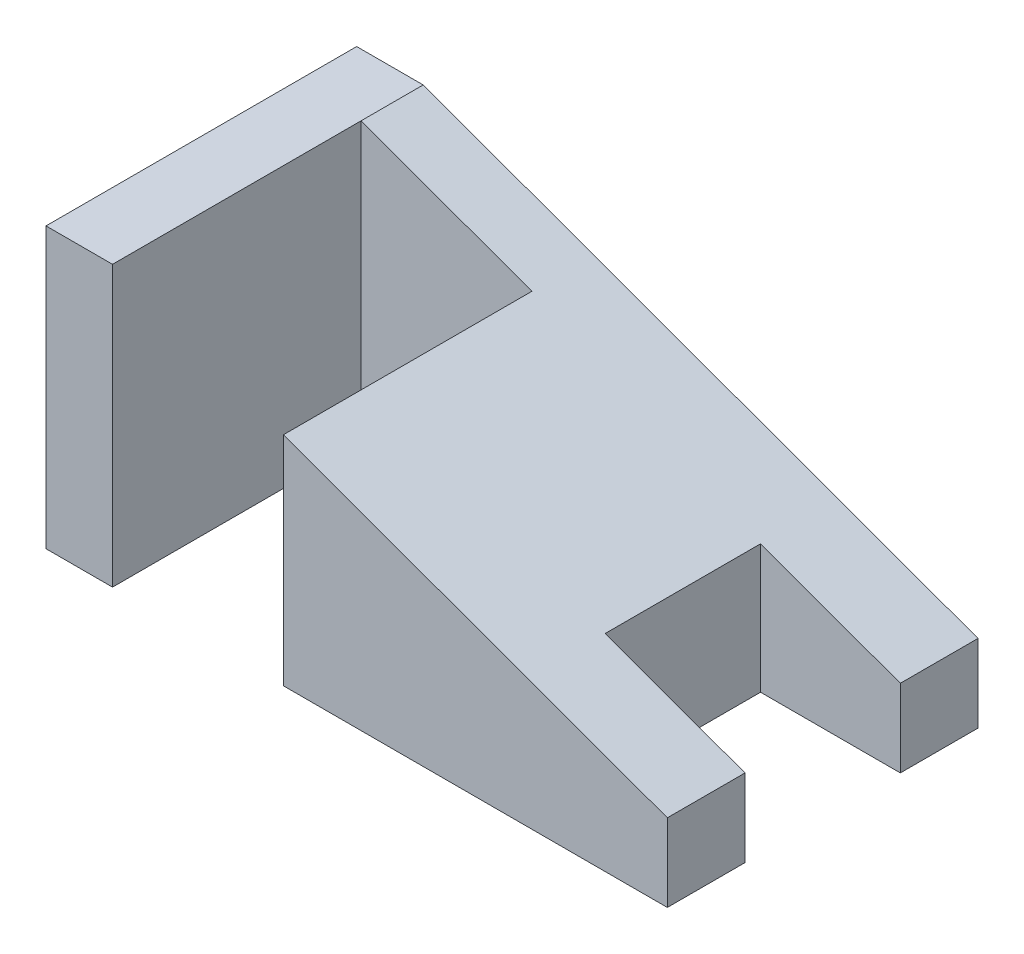
ISO-10303-21;
HEADER;
FILE_DESCRIPTION(('STEP AP214'),'2;1');
FILE_NAME('part.step','',(''),(''),'','','');
FILE_SCHEMA(('AUTOMOTIVE_DESIGN { 1 0 10303 214 1 1 1 1 }'));
ENDSEC;
DATA;
#1=APPLICATION_CONTEXT('core data for automotive mechanical design processes');
#2=APPLICATION_PROTOCOL_DEFINITION('international standard','automotive_design',2000,#1);
#3=PRODUCT_CONTEXT('',#1,'mechanical');
#4=PRODUCT('Part','Part','',(#3));
#5=PRODUCT_RELATED_PRODUCT_CATEGORY('part','',(#4));
#6=PRODUCT_DEFINITION_FORMATION('','',#4);
#7=PRODUCT_DEFINITION_CONTEXT('part definition',#1,'design');
#8=PRODUCT_DEFINITION('design','',#6,#7);
#9=PRODUCT_DEFINITION_SHAPE('','',#8);
#10=(LENGTH_UNIT() NAMED_UNIT(*) SI_UNIT(.MILLI.,.METRE.));
#11=(NAMED_UNIT(*) PLANE_ANGLE_UNIT() SI_UNIT($,.RADIAN.));
#12=(NAMED_UNIT(*) SI_UNIT($,.STERADIAN.) SOLID_ANGLE_UNIT());
#13=UNCERTAINTY_MEASURE_WITH_UNIT(LENGTH_MEASURE(1.E-05),#10,'distance_accuracy_value','');
#14=(GEOMETRIC_REPRESENTATION_CONTEXT(3) GLOBAL_UNCERTAINTY_ASSIGNED_CONTEXT((#13)) GLOBAL_UNIT_ASSIGNED_CONTEXT((#10,
#11,#12)) REPRESENTATION_CONTEXT('',''));
#15=CARTESIAN_POINT('',(0.,0.,0.));
#16=DIRECTION('',(0.,0.,1.));
#17=DIRECTION('',(1.,0.,0.));
#18=AXIS2_PLACEMENT_3D('',#15,#16,#17);
#19=CARTESIAN_POINT('',(200.,0.,100.));
#20=DIRECTION('',(-1.,0.,0.));
#21=DIRECTION('',(0.,0.,1.));
#22=AXIS2_PLACEMENT_3D('',#19,#20,#21);
#23=PLANE('',#22);
#24=DIRECTION('',(0.,1.,0.));
#25=VECTOR('',#24,1.);
#26=CARTESIAN_POINT('',(200.,-0.001000000000001,25.));
#27=LINE('',#26,#25);
#28=CARTESIAN_POINT('',(200.,0.,25.));
#29=VERTEX_POINT('',#28);
#30=CARTESIAN_POINT('',(200.,25.,25.));
#31=VERTEX_POINT('',#30);
#32=EDGE_CURVE('E189',#29,#31,#27,.T.);
#33=ORIENTED_EDGE('',*,*,#32,.F.);
#34=DIRECTION('',(0.,0.,-1.));
#35=VECTOR('',#34,1.);
#36=CARTESIAN_POINT('',(200.,0.,100.));
#37=LINE('',#36,#35);
#38=CARTESIAN_POINT('',(200.,0.,0.));
#39=VERTEX_POINT('',#38);
#40=EDGE_CURVE('E178',#29,#39,#37,.T.);
#41=ORIENTED_EDGE('',*,*,#40,.T.);
#42=DIRECTION('',(0.,1.,0.));
#43=VECTOR('',#42,1.);
#44=CARTESIAN_POINT('',(200.,0.,0.));
#45=LINE('',#44,#43);
#46=CARTESIAN_POINT('',(200.,25.,0.));
#47=VERTEX_POINT('',#46);
#48=EDGE_CURVE('E167',#39,#47,#45,.T.);
#49=ORIENTED_EDGE('',*,*,#48,.T.);
#50=DIRECTION('',(0.,0.,-1.));
#51=VECTOR('',#50,1.);
#52=CARTESIAN_POINT('',(200.,25.,100.));
#53=LINE('',#52,#51);
#54=EDGE_CURVE('E140',#31,#47,#53,.T.);
#55=ORIENTED_EDGE('',*,*,#54,.F.);
#56=EDGE_LOOP('',(#33,#41,#49,#55));
#57=FACE_BOUND('',#56,.T.);
#58=ADVANCED_FACE('F39',(#57),#23,.F.);
#59=CARTESIAN_POINT('',(0.,0.,100.));
#60=DIRECTION('',(0.,0.,1.));
#61=DIRECTION('',(1.,0.,0.));
#62=AXIS2_PLACEMENT_3D('',#59,#60,#61);
#63=PLANE('',#62);
#64=DIRECTION('',(1.,0.,0.));
#65=VECTOR('',#64,1.);
#66=CARTESIAN_POINT('',(0.,0.,100.));
#67=LINE('',#66,#65);
#68=CARTESIAN_POINT('',(0.,0.,100.));
#69=VERTEX_POINT('',#68);
#70=CARTESIAN_POINT('',(21.4139677354461,0.,100.));
#71=VERTEX_POINT('',#70);
#72=EDGE_CURVE('E147',#69,#71,#67,.T.);
#73=ORIENTED_EDGE('',*,*,#72,.T.);
#74=DIRECTION('',(0.,1.,0.));
#75=VECTOR('',#74,1.);
#76=CARTESIAN_POINT('',(21.4139677354461,-0.001000000000001,100.));
#77=LINE('',#76,#75);
#78=CARTESIAN_POINT('',(21.4139677354461,90.,100.));
#79=VERTEX_POINT('',#78);
#80=EDGE_CURVE('E135',#71,#79,#77,.T.);
#81=ORIENTED_EDGE('',*,*,#80,.T.);
#82=DIRECTION('',(-1.,0.,0.));
#83=VECTOR('',#82,1.);
#84=CARTESIAN_POINT('',(21.4139677354461,90.,100.));
#85=LINE('',#84,#83);
#86=CARTESIAN_POINT('',(0.,90.,100.));
#87=VERTEX_POINT('',#86);
#88=EDGE_CURVE('E143',#79,#87,#85,.T.);
#89=ORIENTED_EDGE('',*,*,#88,.T.);
#90=DIRECTION('',(0.,-1.,0.));
#91=VECTOR('',#90,1.);
#92=CARTESIAN_POINT('',(0.,90.,100.));
#93=LINE('',#92,#91);
#94=EDGE_CURVE('E174',#87,#69,#93,.T.);
#95=ORIENTED_EDGE('',*,*,#94,.T.);
#96=EDGE_LOOP('',(#73,#81,#89,#95));
#97=FACE_BOUND('',#96,.T.);
#98=ADVANCED_FACE('F145',(#97),#63,.T.);
#99=CARTESIAN_POINT('',(0.,0.,100.));
#100=DIRECTION('',(0.,1.,0.));
#101=DIRECTION('',(-1.,0.,0.));
#102=AXIS2_PLACEMENT_3D('',#99,#100,#101);
#103=PLANE('',#102);
#104=DIRECTION('',(0.,0.,-1.));
#105=VECTOR('',#104,1.);
#106=CARTESIAN_POINT('',(21.4139677354461,0.,100.));
#107=LINE('',#106,#105);
#108=CARTESIAN_POINT('',(21.4139677354461,0.,20.));
#109=VERTEX_POINT('',#108);
#110=EDGE_CURVE('E53',#71,#109,#107,.T.);
#111=ORIENTED_EDGE('',*,*,#110,.F.);
#112=ORIENTED_EDGE('',*,*,#72,.F.);
#113=DIRECTION('',(0.,0.,-1.));
#114=VECTOR('',#113,1.);
#115=CARTESIAN_POINT('',(0.,0.,100.));
#116=LINE('',#115,#114);
#117=CARTESIAN_POINT('',(0.,0.,0.));
#118=VERTEX_POINT('',#117);
#119=EDGE_CURVE('E11',#69,#118,#116,.T.);
#120=ORIENTED_EDGE('',*,*,#119,.T.);
#121=DIRECTION('',(1.,0.,0.));
#122=VECTOR('',#121,1.);
#123=CARTESIAN_POINT('',(0.,0.,0.));
#124=LINE('',#123,#122);
#125=EDGE_CURVE('E164',#118,#39,#124,.T.);
#126=ORIENTED_EDGE('',*,*,#125,.T.);
#127=ORIENTED_EDGE('',*,*,#40,.F.);
#128=DIRECTION('',(1.,0.,0.));
#129=VECTOR('',#128,1.);
#130=CARTESIAN_POINT('',(200.,0.,25.));
#131=LINE('',#130,#129);
#132=CARTESIAN_POINT('',(155.,0.,25.));
#133=VERTEX_POINT('',#132);
#134=EDGE_CURVE('E209',#133,#29,#131,.T.);
#135=ORIENTED_EDGE('',*,*,#134,.F.);
#136=DIRECTION('',(0.,0.,-1.));
#137=VECTOR('',#136,1.);
#138=CARTESIAN_POINT('',(155.,0.,25.));
#139=LINE('',#138,#137);
#140=CARTESIAN_POINT('',(155.,0.,75.));
#141=VERTEX_POINT('',#140);
#142=EDGE_CURVE('E225',#141,#133,#139,.T.);
#143=ORIENTED_EDGE('',*,*,#142,.F.);
#144=DIRECTION('',(-1.,0.,0.));
#145=VECTOR('',#144,1.);
#146=CARTESIAN_POINT('',(155.,0.,75.));
#147=LINE('',#146,#145);
#148=CARTESIAN_POINT('',(200.,0.,75.));
#149=VERTEX_POINT('',#148);
#150=EDGE_CURVE('E218',#149,#141,#147,.T.);
#151=ORIENTED_EDGE('',*,*,#150,.F.);
#152=CARTESIAN_POINT('',(200.,0.,100.));
#153=VERTEX_POINT('',#152);
#154=EDGE_CURVE('E50',#153,#149,#37,.T.);
#155=ORIENTED_EDGE('',*,*,#154,.F.);
#156=CARTESIAN_POINT('',(76.4139677354461,0.,100.));
#157=VERTEX_POINT('',#156);
#158=EDGE_CURVE('E229',#157,#153,#67,.T.);
#159=ORIENTED_EDGE('',*,*,#158,.F.);
#160=DIRECTION('',(0.,0.,1.));
#161=VECTOR('',#160,1.);
#162=CARTESIAN_POINT('',(76.4139677354461,0.,20.));
#163=LINE('',#162,#161);
#164=CARTESIAN_POINT('',(76.4139677354461,0.,20.));
#165=VERTEX_POINT('',#164);
#166=EDGE_CURVE('E245',#165,#157,#163,.T.);
#167=ORIENTED_EDGE('',*,*,#166,.F.);
#168=DIRECTION('',(1.,0.,0.));
#169=VECTOR('',#168,1.);
#170=CARTESIAN_POINT('',(21.4139677354461,0.,20.));
#171=LINE('',#170,#169);
#172=EDGE_CURVE('E247',#109,#165,#171,.T.);
#173=ORIENTED_EDGE('',*,*,#172,.F.);
#174=EDGE_LOOP('',(#111,#112,#120,#126,#127,#135,#143,#151,#155,#159,#167,#173));
#175=FACE_BOUND('',#174,.T.);
#176=ADVANCED_FACE('F194',(#175),#103,.F.);
#177=CARTESIAN_POINT('',(200.,25.,100.));
#178=DIRECTION('',(-0.342020143325663,-0.93969262078591,0.));
#179=DIRECTION('',(0.939692620785911,-0.342020143325663,0.));
#180=AXIS2_PLACEMENT_3D('',#177,#178,#179);
#181=PLANE('',#180);
#182=DIRECTION('',(0.,0.,-1.));
#183=VECTOR('',#182,1.);
#184=CARTESIAN_POINT('',(76.4139677354461,69.9816371153592,20.));
#185=LINE('',#184,#183);
#186=CARTESIAN_POINT('',(76.4139677354461,69.9816371153593,100.));
#187=VERTEX_POINT('',#186);
#188=CARTESIAN_POINT('',(76.4139677354461,69.9816371153592,20.));
#189=VERTEX_POINT('',#188);
#190=EDGE_CURVE('E228',#187,#189,#185,.T.);
#191=ORIENTED_EDGE('',*,*,#190,.F.);
#192=DIRECTION('',(-0.939692620785911,0.342020143325663,0.));
#193=VECTOR('',#192,1.);
#194=CARTESIAN_POINT('',(200.,25.,100.));
#195=LINE('',#194,#193);
#196=CARTESIAN_POINT('',(200.,25.,100.));
#197=VERTEX_POINT('',#196);
#198=EDGE_CURVE('E153',#197,#187,#195,.T.);
#199=ORIENTED_EDGE('',*,*,#198,.F.);
#200=CARTESIAN_POINT('',(200.,25.,75.));
#201=VERTEX_POINT('',#200);
#202=EDGE_CURVE('E176',#197,#201,#53,.T.);
#203=ORIENTED_EDGE('',*,*,#202,.T.);
#204=DIRECTION('',(0.939692620785911,-0.342020143325663,0.));
#205=VECTOR('',#204,1.);
#206=CARTESIAN_POINT('',(168.299166544709,36.5381597791558,75.));
#207=LINE('',#206,#205);
#208=CARTESIAN_POINT('',(155.,41.3786605419788,75.));
#209=VERTEX_POINT('',#208);
#210=EDGE_CURVE('E224',#209,#201,#207,.T.);
#211=ORIENTED_EDGE('',*,*,#210,.F.);
#212=DIRECTION('',(0.,0.,1.));
#213=VECTOR('',#212,1.);
#214=CARTESIAN_POINT('',(155.,41.3786605419788,25.));
#215=LINE('',#214,#213);
#216=CARTESIAN_POINT('',(155.,41.3786605419788,25.));
#217=VERTEX_POINT('',#216);
#218=EDGE_CURVE('E210',#217,#209,#215,.T.);
#219=ORIENTED_EDGE('',*,*,#218,.F.);
#220=DIRECTION('',(-0.939692620785911,0.342020143325663,0.));
#221=VECTOR('',#220,1.);
#222=CARTESIAN_POINT('',(208.035166514886,22.0754385612089,25.));
#223=LINE('',#222,#221);
#224=EDGE_CURVE('E65',#31,#217,#223,.T.);
#225=ORIENTED_EDGE('',*,*,#224,.F.);
#226=ORIENTED_EDGE('',*,*,#54,.T.);
#227=DIRECTION('',(-0.939692620785911,0.342020143325663,0.));
#228=VECTOR('',#227,1.);
#229=CARTESIAN_POINT('',(200.,25.,0.));
#230=LINE('',#229,#228);
#231=CARTESIAN_POINT('',(21.4139677354461,90.,0.));
#232=VERTEX_POINT('',#231);
#233=EDGE_CURVE('E169',#47,#232,#230,.T.);
#234=ORIENTED_EDGE('',*,*,#233,.T.);
#235=DIRECTION('',(0.,0.,-1.));
#236=VECTOR('',#235,1.);
#237=CARTESIAN_POINT('',(21.4139677354461,90.,100.));
#238=LINE('',#237,#236);
#239=CARTESIAN_POINT('',(21.4139677354461,90.,20.));
#240=VERTEX_POINT('',#239);
#241=EDGE_CURVE('E138',#240,#232,#238,.T.);
#242=ORIENTED_EDGE('',*,*,#241,.F.);
#243=DIRECTION('',(-0.939692620785911,0.342020143325663,0.));
#244=VECTOR('',#243,1.);
#245=CARTESIAN_POINT('',(50.3397315651448,79.4718829625759,20.));
#246=LINE('',#245,#244);
#247=EDGE_CURVE('E236',#189,#240,#246,.T.);
#248=ORIENTED_EDGE('',*,*,#247,.F.);
#249=EDGE_LOOP('',(#191,#199,#203,#211,#219,#225,#226,#234,#242,#248));
#250=FACE_BOUND('',#249,.T.);
#251=ADVANCED_FACE('F205',(#250),#181,.F.);
#252=CARTESIAN_POINT('',(0.,90.,100.));
#253=DIRECTION('',(1.,0.,0.));
#254=DIRECTION('',(0.,1.,0.));
#255=AXIS2_PLACEMENT_3D('',#252,#253,#254);
#256=PLANE('',#255);
#257=DIRECTION('',(0.,-1.,0.));
#258=VECTOR('',#257,1.);
#259=CARTESIAN_POINT('',(0.,90.,0.));
#260=LINE('',#259,#258);
#261=CARTESIAN_POINT('',(0.,90.,0.));
#262=VERTEX_POINT('',#261);
#263=EDGE_CURVE('E162',#262,#118,#260,.T.);
#264=ORIENTED_EDGE('',*,*,#263,.T.);
#265=ORIENTED_EDGE('',*,*,#119,.F.);
#266=ORIENTED_EDGE('',*,*,#94,.F.);
#267=DIRECTION('',(0.,0.,-1.));
#268=VECTOR('',#267,1.);
#269=CARTESIAN_POINT('',(0.,90.,100.));
#270=LINE('',#269,#268);
#271=EDGE_CURVE('E152',#87,#262,#270,.T.);
#272=ORIENTED_EDGE('',*,*,#271,.T.);
#273=EDGE_LOOP('',(#264,#265,#266,#272));
#274=FACE_BOUND('',#273,.T.);
#275=ADVANCED_FACE('F41',(#274),#256,.F.);
#276=ORIENTED_EDGE('',*,*,#154,.T.);
#277=DIRECTION('',(0.,1.,0.));
#278=VECTOR('',#277,1.);
#279=CARTESIAN_POINT('',(200.,-0.001000000000001,75.));
#280=LINE('',#279,#278);
#281=EDGE_CURVE('E208',#149,#201,#280,.T.);
#282=ORIENTED_EDGE('',*,*,#281,.T.);
#283=ORIENTED_EDGE('',*,*,#202,.F.);
#284=DIRECTION('',(0.,1.,0.));
#285=VECTOR('',#284,1.);
#286=CARTESIAN_POINT('',(200.,0.,100.));
#287=LINE('',#286,#285);
#288=EDGE_CURVE('E160',#153,#197,#287,.T.);
#289=ORIENTED_EDGE('',*,*,#288,.F.);
#290=EDGE_LOOP('',(#276,#282,#283,#289));
#291=FACE_BOUND('',#290,.T.);
#292=ADVANCED_FACE('F240',(#291),#23,.F.);
#293=CARTESIAN_POINT('',(21.4139677354461,90.,100.));
#294=DIRECTION('',(0.,-1.,0.));
#295=DIRECTION('',(0.,0.,-1.));
#296=AXIS2_PLACEMENT_3D('',#293,#294,#295);
#297=PLANE('',#296);
#298=DIRECTION('',(-1.,0.,0.));
#299=VECTOR('',#298,1.);
#300=CARTESIAN_POINT('',(21.4139677354461,90.,0.));
#301=LINE('',#300,#299);
#302=EDGE_CURVE('E171',#232,#262,#301,.T.);
#303=ORIENTED_EDGE('',*,*,#302,.T.);
#304=ORIENTED_EDGE('',*,*,#271,.F.);
#305=ORIENTED_EDGE('',*,*,#88,.F.);
#306=EDGE_CURVE('E129',#79,#240,#238,.T.);
#307=ORIENTED_EDGE('',*,*,#306,.T.);
#308=ORIENTED_EDGE('',*,*,#241,.T.);
#309=EDGE_LOOP('',(#303,#304,#305,#307,#308));
#310=FACE_BOUND('',#309,.T.);
#311=ADVANCED_FACE('F146',(#310),#297,.F.);
#312=DIRECTION('',(0.,1.,0.));
#313=VECTOR('',#312,1.);
#314=CARTESIAN_POINT('',(76.4139677354461,-0.001000000000001,100.));
#315=LINE('',#314,#313);
#316=EDGE_CURVE('E150',#157,#187,#315,.T.);
#317=ORIENTED_EDGE('',*,*,#316,.F.);
#318=ORIENTED_EDGE('',*,*,#158,.T.);
#319=ORIENTED_EDGE('',*,*,#288,.T.);
#320=ORIENTED_EDGE('',*,*,#198,.T.);
#321=EDGE_LOOP('',(#317,#318,#319,#320));
#322=FACE_BOUND('',#321,.T.);
#323=ADVANCED_FACE('F233',(#322),#63,.T.);
#324=CARTESIAN_POINT('',(0.,0.,0.));
#325=DIRECTION('',(0.,0.,1.));
#326=DIRECTION('',(1.,0.,0.));
#327=AXIS2_PLACEMENT_3D('',#324,#325,#326);
#328=PLANE('',#327);
#329=ORIENTED_EDGE('',*,*,#263,.F.);
#330=ORIENTED_EDGE('',*,*,#302,.F.);
#331=ORIENTED_EDGE('',*,*,#233,.F.);
#332=ORIENTED_EDGE('',*,*,#48,.F.);
#333=ORIENTED_EDGE('',*,*,#125,.F.);
#334=EDGE_LOOP('',(#329,#330,#331,#332,#333));
#335=FACE_BOUND('',#334,.T.);
#336=ADVANCED_FACE('F200',(#335),#328,.F.);
#337=CARTESIAN_POINT('',(155.,-0.001000000000001,75.));
#338=DIRECTION('',(0.,0.,1.));
#339=DIRECTION('',(1.,0.,0.));
#340=AXIS2_PLACEMENT_3D('',#337,#338,#339);
#341=PLANE('',#340);
#342=ORIENTED_EDGE('',*,*,#150,.T.);
#343=DIRECTION('',(0.,1.,0.));
#344=VECTOR('',#343,1.);
#345=CARTESIAN_POINT('',(155.,-0.001000000000001,75.));
#346=LINE('',#345,#344);
#347=EDGE_CURVE('E213',#141,#209,#346,.T.);
#348=ORIENTED_EDGE('',*,*,#347,.T.);
#349=ORIENTED_EDGE('',*,*,#210,.T.);
#350=ORIENTED_EDGE('',*,*,#281,.F.);
#351=EDGE_LOOP('',(#342,#348,#349,#350));
#352=FACE_BOUND('',#351,.T.);
#353=ADVANCED_FACE('F260',(#352),#341,.F.);
#354=CARTESIAN_POINT('',(155.,-0.001000000000001,25.));
#355=DIRECTION('',(-1.,0.,0.));
#356=DIRECTION('',(0.,0.,1.));
#357=AXIS2_PLACEMENT_3D('',#354,#355,#356);
#358=PLANE('',#357);
#359=ORIENTED_EDGE('',*,*,#142,.T.);
#360=DIRECTION('',(0.,1.,0.));
#361=VECTOR('',#360,1.);
#362=CARTESIAN_POINT('',(155.,-0.001000000000001,25.));
#363=LINE('',#362,#361);
#364=EDGE_CURVE('E220',#133,#217,#363,.T.);
#365=ORIENTED_EDGE('',*,*,#364,.T.);
#366=ORIENTED_EDGE('',*,*,#218,.T.);
#367=ORIENTED_EDGE('',*,*,#347,.F.);
#368=EDGE_LOOP('',(#359,#365,#366,#367));
#369=FACE_BOUND('',#368,.T.);
#370=ADVANCED_FACE('F263',(#369),#358,.F.);
#371=CARTESIAN_POINT('',(200.,-0.001000000000001,25.));
#372=DIRECTION('',(0.,0.,-1.));
#373=DIRECTION('',(-1.,0.,0.));
#374=AXIS2_PLACEMENT_3D('',#371,#372,#373);
#375=PLANE('',#374);
#376=ORIENTED_EDGE('',*,*,#134,.T.);
#377=ORIENTED_EDGE('',*,*,#32,.T.);
#378=ORIENTED_EDGE('',*,*,#224,.T.);
#379=ORIENTED_EDGE('',*,*,#364,.F.);
#380=EDGE_LOOP('',(#376,#377,#378,#379));
#381=FACE_BOUND('',#380,.T.);
#382=ADVANCED_FACE('F265',(#381),#375,.F.);
#383=CARTESIAN_POINT('',(21.4139677354461,-0.001000000000001,100.));
#384=DIRECTION('',(-1.,0.,0.));
#385=DIRECTION('',(0.,0.,1.));
#386=AXIS2_PLACEMENT_3D('',#383,#384,#385);
#387=PLANE('',#386);
#388=ORIENTED_EDGE('',*,*,#110,.T.);
#389=DIRECTION('',(0.,1.,0.));
#390=VECTOR('',#389,1.);
#391=CARTESIAN_POINT('',(21.4139677354461,-0.001000000000001,20.));
#392=LINE('',#391,#390);
#393=EDGE_CURVE('E133',#109,#240,#392,.T.);
#394=ORIENTED_EDGE('',*,*,#393,.T.);
#395=ORIENTED_EDGE('',*,*,#306,.F.);
#396=ORIENTED_EDGE('',*,*,#80,.F.);
#397=EDGE_LOOP('',(#388,#394,#395,#396));
#398=FACE_BOUND('',#397,.T.);
#399=ADVANCED_FACE('F131',(#398),#387,.F.);
#400=CARTESIAN_POINT('',(21.4139677354461,-0.001000000000001,20.));
#401=DIRECTION('',(0.,0.,-1.));
#402=DIRECTION('',(-1.,0.,0.));
#403=AXIS2_PLACEMENT_3D('',#400,#401,#402);
#404=PLANE('',#403);
#405=ORIENTED_EDGE('',*,*,#172,.T.);
#406=DIRECTION('',(0.,1.,0.));
#407=VECTOR('',#406,1.);
#408=CARTESIAN_POINT('',(76.4139677354461,-0.001000000000001,20.));
#409=LINE('',#408,#407);
#410=EDGE_CURVE('E252',#165,#189,#409,.T.);
#411=ORIENTED_EDGE('',*,*,#410,.T.);
#412=ORIENTED_EDGE('',*,*,#247,.T.);
#413=ORIENTED_EDGE('',*,*,#393,.F.);
#414=EDGE_LOOP('',(#405,#411,#412,#413));
#415=FACE_BOUND('',#414,.T.);
#416=ADVANCED_FACE('F267',(#415),#404,.F.);
#417=CARTESIAN_POINT('',(76.4139677354461,-0.001000000000001,20.));
#418=DIRECTION('',(1.,0.,0.));
#419=DIRECTION('',(0.,0.,-1.));
#420=AXIS2_PLACEMENT_3D('',#417,#418,#419);
#421=PLANE('',#420);
#422=ORIENTED_EDGE('',*,*,#166,.T.);
#423=ORIENTED_EDGE('',*,*,#316,.T.);
#424=ORIENTED_EDGE('',*,*,#190,.T.);
#425=ORIENTED_EDGE('',*,*,#410,.F.);
#426=EDGE_LOOP('',(#422,#423,#424,#425));
#427=FACE_BOUND('',#426,.T.);
#428=ADVANCED_FACE('F253',(#427),#421,.F.);
#429=CLOSED_SHELL('',(#58,#98,#176,#251,#275,#292,#311,#323,#336,#353,#370,#382,#399,#416,#428));
#430=MANIFOLD_SOLID_BREP('B2',#429);
#431=ADVANCED_BREP_SHAPE_REPRESENTATION('',(#18,#430),#14);
#432=SHAPE_DEFINITION_REPRESENTATION(#9,#431);
ENDSEC;
END-ISO-10303-21;
